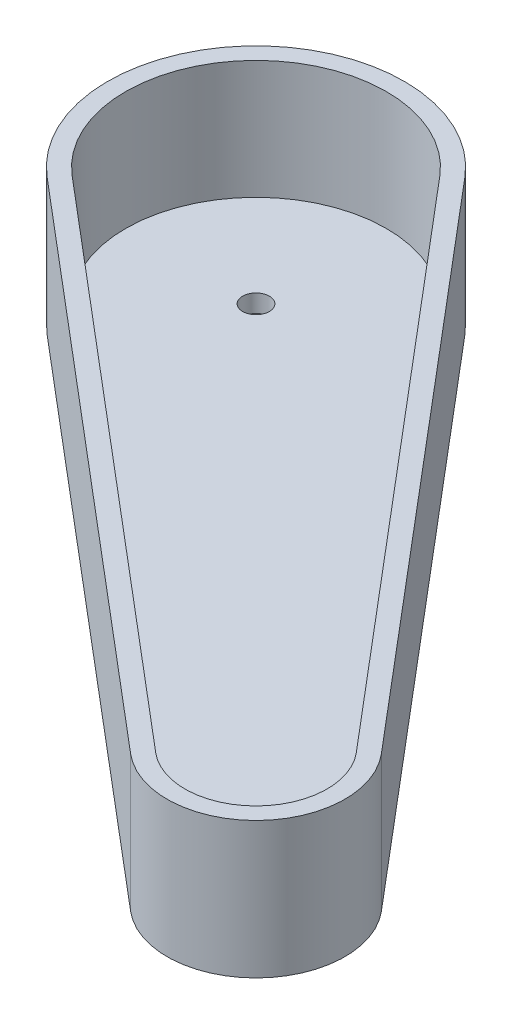
ISO-10303-21;
HEADER;
FILE_DESCRIPTION(('STEP AP214'),'2;1');
FILE_NAME('part.step','',(''),(''),'','','');
FILE_SCHEMA(('AUTOMOTIVE_DESIGN { 1 0 10303 214 1 1 1 1 }'));
ENDSEC;
DATA;
#1=APPLICATION_CONTEXT('core data for automotive mechanical design processes');
#2=APPLICATION_PROTOCOL_DEFINITION('international standard','automotive_design',2000,#1);
#3=PRODUCT_CONTEXT('',#1,'mechanical');
#4=PRODUCT('Part','Part','',(#3));
#5=PRODUCT_RELATED_PRODUCT_CATEGORY('part','',(#4));
#6=PRODUCT_DEFINITION_FORMATION('','',#4);
#7=PRODUCT_DEFINITION_CONTEXT('part definition',#1,'design');
#8=PRODUCT_DEFINITION('design','',#6,#7);
#9=PRODUCT_DEFINITION_SHAPE('','',#8);
#10=(LENGTH_UNIT() NAMED_UNIT(*) SI_UNIT(.MILLI.,.METRE.));
#11=(NAMED_UNIT(*) PLANE_ANGLE_UNIT() SI_UNIT($,.RADIAN.));
#12=(NAMED_UNIT(*) SI_UNIT($,.STERADIAN.) SOLID_ANGLE_UNIT());
#13=UNCERTAINTY_MEASURE_WITH_UNIT(LENGTH_MEASURE(1.E-05),#10,'distance_accuracy_value','');
#14=(GEOMETRIC_REPRESENTATION_CONTEXT(3) GLOBAL_UNCERTAINTY_ASSIGNED_CONTEXT((#13)) GLOBAL_UNIT_ASSIGNED_CONTEXT((#10,
#11,#12)) REPRESENTATION_CONTEXT('',''));
#15=CARTESIAN_POINT('',(0.,0.,0.));
#16=DIRECTION('',(0.,0.,1.));
#17=DIRECTION('',(1.,0.,0.));
#18=AXIS2_PLACEMENT_3D('',#15,#16,#17);
#19=CARTESIAN_POINT('',(-12.9144341357622,3.,15.2714567397174));
#20=DIRECTION('',(0.645721706788111,0.,-0.763572836985869));
#21=DIRECTION('',(-0.763572836985869,0.,-0.645721706788111));
#22=AXIS2_PLACEMENT_3D('',#19,#20,#21);
#23=PLANE('',#22);
#24=DIRECTION('',(0.763572836985869,0.,0.645721706788111));
#25=VECTOR('',#24,1.);
#26=CARTESIAN_POINT('',(-12.9144341357622,0.,15.2714567397174));
#27=LINE('',#26,#25);
#28=CARTESIAN_POINT('',(-58.5694495408956,0.,-23.3370859465461));
#29=VERTEX_POINT('',#28);
#30=CARTESIAN_POINT('',(32.7405812693714,0.,53.8799994259806));
#31=VERTEX_POINT('',#30);
#32=EDGE_CURVE('E133',#29,#31,#27,.T.);
#33=ORIENTED_EDGE('',*,*,#32,.T.);
#34=DIRECTION('',(0.,-1.,0.));
#35=VECTOR('',#34,1.);
#36=CARTESIAN_POINT('',(32.7405812693714,3.,53.8799994259806));
#37=LINE('',#36,#35);
#38=CARTESIAN_POINT('',(32.7405812693718,23.,53.8799994259802));
#39=VERTEX_POINT('',#38);
#40=EDGE_CURVE('E11',#39,#31,#37,.T.);
#41=ORIENTED_EDGE('',*,*,#40,.F.);
#42=DIRECTION('',(0.763572836985869,0.,0.645721706788111));
#43=VECTOR('',#42,1.);
#44=CARTESIAN_POINT('',(-12.9144341357622,23.,15.2714567397174));
#45=LINE('',#44,#43);
#46=CARTESIAN_POINT('',(-58.5694495408956,23.,-23.3370859465461));
#47=VERTEX_POINT('',#46);
#48=EDGE_CURVE('E146',#47,#39,#45,.T.);
#49=ORIENTED_EDGE('',*,*,#48,.F.);
#50=DIRECTION('',(0.,-1.,0.));
#51=VECTOR('',#50,1.);
#52=CARTESIAN_POINT('',(-58.5694495408956,3.,-23.3370859465461));
#53=LINE('',#52,#51);
#54=EDGE_CURVE('E194',#47,#29,#53,.T.);
#55=ORIENTED_EDGE('',*,*,#54,.T.);
#56=EDGE_LOOP('',(#33,#41,#49,#55));
#57=FACE_BOUND('',#56,.T.);
#58=ADVANCED_FACE('F47',(#57),#23,.F.);
#59=CARTESIAN_POINT('',(42.4264068711934,3.,42.4264068711923));
#60=DIRECTION('',(0.,-1.,0.));
#61=DIRECTION('',(0.,0.,-1.));
#62=AXIS2_PLACEMENT_3D('',#59,#60,#61);
#63=CYLINDRICAL_SURFACE('',#62,15.);
#64=CARTESIAN_POINT('',(42.4264068711934,0.,42.4264068711923));
#65=DIRECTION('',(0.,1.,0.));
#66=DIRECTION('',(0.,0.,1.));
#67=AXIS2_PLACEMENT_3D('',#64,#65,#66);
#68=CIRCLE('',#67,15.);
#69=CARTESIAN_POINT('',(53.8799994259812,0.,32.740581269371));
#70=VERTEX_POINT('',#69);
#71=EDGE_CURVE('E183',#31,#70,#68,.T.);
#72=ORIENTED_EDGE('',*,*,#71,.T.);
#73=DIRECTION('',(0.,-1.,0.));
#74=VECTOR('',#73,1.);
#75=CARTESIAN_POINT('',(53.8799994259812,3.,32.740581269371));
#76=LINE('',#75,#74);
#77=CARTESIAN_POINT('',(53.8799994259811,23.,32.7405812693711));
#78=VERTEX_POINT('',#77);
#79=EDGE_CURVE('E55',#78,#70,#76,.T.);
#80=ORIENTED_EDGE('',*,*,#79,.F.);
#81=CARTESIAN_POINT('',(42.4264068711934,23.,42.4264068711923));
#82=DIRECTION('',(0.,1.,0.));
#83=DIRECTION('',(0.,0.,1.));
#84=AXIS2_PLACEMENT_3D('',#81,#82,#83);
#85=CIRCLE('',#84,14.9999999999996);
#86=EDGE_CURVE('E150',#39,#78,#85,.T.);
#87=ORIENTED_EDGE('',*,*,#86,.F.);
#88=ORIENTED_EDGE('',*,*,#40,.T.);
#89=EDGE_LOOP('',(#72,#80,#87,#88));
#90=FACE_BOUND('',#89,.T.);
#91=ADVANCED_FACE('F207',(#90),#63,.T.);
#92=CARTESIAN_POINT('',(15.2714567397174,3.,-12.9144341357622));
#93=DIRECTION('',(0.763572836985869,0.,-0.645721706788111));
#94=DIRECTION('',(-0.645721706788111,0.,-0.763572836985869));
#95=AXIS2_PLACEMENT_3D('',#92,#93,#94);
#96=PLANE('',#95);
#97=DIRECTION('',(0.645721706788111,0.,0.763572836985869));
#98=VECTOR('',#97,1.);
#99=CARTESIAN_POINT('',(15.2714567397174,0.,-12.9144341357622));
#100=LINE('',#99,#98);
#101=CARTESIAN_POINT('',(-23.3370859465461,0.,-58.5694495408956));
#102=VERTEX_POINT('',#101);
#103=EDGE_CURVE('E187',#102,#70,#100,.T.);
#104=ORIENTED_EDGE('',*,*,#103,.F.);
#105=DIRECTION('',(0.,-1.,0.));
#106=VECTOR('',#105,1.);
#107=CARTESIAN_POINT('',(-23.3370859465461,3.,-58.5694495408956));
#108=LINE('',#107,#106);
#109=CARTESIAN_POINT('',(-23.3370859465461,23.,-58.5694495408956));
#110=VERTEX_POINT('',#109);
#111=EDGE_CURVE('E198',#110,#102,#108,.T.);
#112=ORIENTED_EDGE('',*,*,#111,.F.);
#113=DIRECTION('',(-0.645721706788111,0.,-0.763572836985869));
#114=VECTOR('',#113,1.);
#115=CARTESIAN_POINT('',(15.2714567397174,23.,-12.9144341357622));
#116=LINE('',#115,#114);
#117=EDGE_CURVE('E154',#78,#110,#116,.T.);
#118=ORIENTED_EDGE('',*,*,#117,.F.);
#119=ORIENTED_EDGE('',*,*,#79,.T.);
#120=EDGE_LOOP('',(#104,#112,#118,#119));
#121=FACE_BOUND('',#120,.T.);
#122=ADVANCED_FACE('F204',(#121),#96,.T.);
#123=CARTESIAN_POINT('',(-42.4264068711929,3.,-42.4264068711928));
#124=DIRECTION('',(0.,-1.,0.));
#125=DIRECTION('',(0.,0.,-1.));
#126=AXIS2_PLACEMENT_3D('',#123,#124,#125);
#127=CYLINDRICAL_SURFACE('',#126,25.);
#128=CARTESIAN_POINT('',(-42.4264068711929,0.,-42.4264068711928));
#129=DIRECTION('',(0.,1.,0.));
#130=DIRECTION('',(0.,0.,1.));
#131=AXIS2_PLACEMENT_3D('',#128,#129,#130);
#132=CIRCLE('',#131,25.);
#133=EDGE_CURVE('E191',#102,#29,#132,.T.);
#134=ORIENTED_EDGE('',*,*,#133,.T.);
#135=ORIENTED_EDGE('',*,*,#54,.F.);
#136=CARTESIAN_POINT('',(-42.4264068711929,23.,-42.4264068711928));
#137=DIRECTION('',(0.,1.,0.));
#138=DIRECTION('',(0.,0.,1.));
#139=AXIS2_PLACEMENT_3D('',#136,#137,#138);
#140=CIRCLE('',#139,25.);
#141=EDGE_CURVE('E158',#110,#47,#140,.T.);
#142=ORIENTED_EDGE('',*,*,#141,.F.);
#143=ORIENTED_EDGE('',*,*,#111,.T.);
#144=EDGE_LOOP('',(#134,#135,#142,#143));
#145=FACE_BOUND('',#144,.T.);
#146=ADVANCED_FACE('F213',(#145),#127,.T.);
#147=CARTESIAN_POINT('',(0.,0.,0.));
#148=DIRECTION('',(0.,1.,0.));
#149=DIRECTION('',(0.,0.,1.));
#150=AXIS2_PLACEMENT_3D('',#147,#148,#149);
#151=PLANE('',#150);
#152=CARTESIAN_POINT('',(-42.4264068711929,0.,-42.4264068711928));
#153=DIRECTION('',(0.,1.,0.));
#154=DIRECTION('',(0.,0.,1.));
#155=AXIS2_PLACEMENT_3D('',#152,#153,#154);
#156=CIRCLE('',#155,2.25);
#157=CARTESIAN_POINT('',(-42.4264068711929,0.,-40.1764068711928));
#158=VERTEX_POINT('',#157);
#159=EDGE_CURVE('E165',#158,#158,#156,.T.);
#160=ORIENTED_EDGE('',*,*,#159,.T.);
#161=EDGE_LOOP('',(#160));
#162=FACE_BOUND('',#161,.T.);
#163=CARTESIAN_POINT('',(42.4264068711934,0.,42.4264068711923));
#164=DIRECTION('',(0.,1.,0.));
#165=DIRECTION('',(0.,0.,1.));
#166=AXIS2_PLACEMENT_3D('',#163,#164,#165);
#167=CIRCLE('',#166,2.5);
#168=CARTESIAN_POINT('',(42.4264068711934,0.,44.9264068711923));
#169=VERTEX_POINT('',#168);
#170=EDGE_CURVE('E310',#169,#169,#167,.T.);
#171=ORIENTED_EDGE('',*,*,#170,.T.);
#172=EDGE_LOOP('',(#171));
#173=FACE_BOUND('',#172,.T.);
#174=ORIENTED_EDGE('',*,*,#32,.F.);
#175=ORIENTED_EDGE('',*,*,#133,.F.);
#176=ORIENTED_EDGE('',*,*,#103,.T.);
#177=ORIENTED_EDGE('',*,*,#71,.F.);
#178=EDGE_LOOP('',(#174,#175,#176,#177));
#179=FACE_BOUND('',#178,.T.);
#180=ADVANCED_FACE('F211',(#162,#173,#179),#151,.F.);
#181=CARTESIAN_POINT('',(12.9807382287599,23.,-10.977269015398));
#182=DIRECTION('',(0.763572836985867,0.,-0.645721706788114));
#183=DIRECTION('',(-0.645721706788114,0.,-0.763572836985867));
#184=AXIS2_PLACEMENT_3D('',#181,#182,#183);
#185=PLANE('',#184);
#186=DIRECTION('',(0.645721706788114,0.,0.763572836985867));
#187=VECTOR('',#186,1.);
#188=CARTESIAN_POINT('',(12.9807382287599,3.,-10.977269015398));
#189=LINE('',#188,#187);
#190=CARTESIAN_POINT('',(-25.6278044575038,3.,-56.6322844205313));
#191=VERTEX_POINT('',#190);
#192=CARTESIAN_POINT('',(51.5892809150235,3.,34.6777463897352));
#193=VERTEX_POINT('',#192);
#194=EDGE_CURVE('E130',#191,#193,#189,.T.);
#195=ORIENTED_EDGE('',*,*,#194,.T.);
#196=DIRECTION('',(0.,-1.,0.));
#197=VECTOR('',#196,1.);
#198=CARTESIAN_POINT('',(51.5892809150235,23.,34.6777463897352));
#199=LINE('',#198,#197);
#200=CARTESIAN_POINT('',(51.5892809150235,23.,34.6777463897352));
#201=VERTEX_POINT('',#200);
#202=EDGE_CURVE('E128',#201,#193,#199,.T.);
#203=ORIENTED_EDGE('',*,*,#202,.F.);
#204=DIRECTION('',(0.645721706788114,0.,0.763572836985867));
#205=VECTOR('',#204,1.);
#206=CARTESIAN_POINT('',(12.9807382287599,23.,-10.977269015398));
#207=LINE('',#206,#205);
#208=CARTESIAN_POINT('',(-25.6278044575038,23.,-56.6322844205313));
#209=VERTEX_POINT('',#208);
#210=EDGE_CURVE('E112',#209,#201,#207,.T.);
#211=ORIENTED_EDGE('',*,*,#210,.F.);
#212=DIRECTION('',(0.,-1.,0.));
#213=VECTOR('',#212,1.);
#214=CARTESIAN_POINT('',(-25.6278044575038,23.,-56.6322844205313));
#215=LINE('',#214,#213);
#216=EDGE_CURVE('E162',#209,#191,#215,.T.);
#217=ORIENTED_EDGE('',*,*,#216,.T.);
#218=EDGE_LOOP('',(#195,#203,#211,#217));
#219=FACE_BOUND('',#218,.T.);
#220=ADVANCED_FACE('F129',(#219),#185,.F.);
#221=CARTESIAN_POINT('',(42.4264068711934,23.,42.4264068711923));
#222=DIRECTION('',(0.,-1.,0.));
#223=DIRECTION('',(0.,0.,-1.));
#224=AXIS2_PLACEMENT_3D('',#221,#222,#223);
#225=CYLINDRICAL_SURFACE('',#224,11.9999999999996);
#226=CARTESIAN_POINT('',(42.4264068711934,3.,42.4264068711923));
#227=DIRECTION('',(0.,1.,0.));
#228=DIRECTION('',(0.,0.,1.));
#229=AXIS2_PLACEMENT_3D('',#226,#227,#228);
#230=CIRCLE('',#229,11.9999999999996);
#231=CARTESIAN_POINT('',(34.6777463897364,3.,51.5892809150226));
#232=VERTEX_POINT('',#231);
#233=EDGE_CURVE('E62',#232,#193,#230,.T.);
#234=ORIENTED_EDGE('',*,*,#233,.F.);
#235=DIRECTION('',(0.,-1.,0.));
#236=VECTOR('',#235,1.);
#237=CARTESIAN_POINT('',(34.6777463897364,23.,51.5892809150226));
#238=LINE('',#237,#236);
#239=CARTESIAN_POINT('',(34.6777463897364,23.,51.5892809150226));
#240=VERTEX_POINT('',#239);
#241=EDGE_CURVE('E134',#240,#232,#238,.T.);
#242=ORIENTED_EDGE('',*,*,#241,.F.);
#243=CARTESIAN_POINT('',(42.4264068711934,23.,42.4264068711923));
#244=DIRECTION('',(0.,1.,0.));
#245=DIRECTION('',(0.,0.,1.));
#246=AXIS2_PLACEMENT_3D('',#243,#244,#245);
#247=CIRCLE('',#246,11.9999999999996);
#248=EDGE_CURVE('E118',#240,#201,#247,.T.);
#249=ORIENTED_EDGE('',*,*,#248,.T.);
#250=ORIENTED_EDGE('',*,*,#202,.T.);
#251=EDGE_LOOP('',(#234,#242,#249,#250));
#252=FACE_BOUND('',#251,.T.);
#253=ADVANCED_FACE('F136',(#252),#225,.F.);
#254=CARTESIAN_POINT('',(-10.9772690153974,23.,12.9807382287595));
#255=DIRECTION('',(0.645721706788104,0.,-0.763572836985875));
#256=DIRECTION('',(-0.763572836985875,0.,-0.645721706788104));
#257=AXIS2_PLACEMENT_3D('',#254,#255,#256);
#258=PLANE('',#257);
#259=DIRECTION('',(0.763572836985875,0.,0.645721706788104));
#260=VECTOR('',#259,1.);
#261=CARTESIAN_POINT('',(-10.9772690153974,3.,12.9807382287595));
#262=LINE('',#261,#260);
#263=CARTESIAN_POINT('',(-56.6322844205312,3.,-25.6278044575036));
#264=VERTEX_POINT('',#263);
#265=EDGE_CURVE('E67',#264,#232,#262,.T.);
#266=ORIENTED_EDGE('',*,*,#265,.F.);
#267=DIRECTION('',(0.,-1.,0.));
#268=VECTOR('',#267,1.);
#269=CARTESIAN_POINT('',(-56.6322844205312,23.,-25.6278044575035));
#270=LINE('',#269,#268);
#271=CARTESIAN_POINT('',(-56.6322844205312,23.,-25.6278044575035));
#272=VERTEX_POINT('',#271);
#273=EDGE_CURVE('E174',#272,#264,#270,.T.);
#274=ORIENTED_EDGE('',*,*,#273,.F.);
#275=DIRECTION('',(0.763572836985875,0.,0.645721706788104));
#276=VECTOR('',#275,1.);
#277=CARTESIAN_POINT('',(-10.9772690153974,23.,12.9807382287595));
#278=LINE('',#277,#276);
#279=EDGE_CURVE('E138',#272,#240,#278,.T.);
#280=ORIENTED_EDGE('',*,*,#279,.T.);
#281=ORIENTED_EDGE('',*,*,#241,.T.);
#282=EDGE_LOOP('',(#266,#274,#280,#281));
#283=FACE_BOUND('',#282,.T.);
#284=ADVANCED_FACE('F229',(#283),#258,.T.);
#285=CARTESIAN_POINT('',(-42.4264068711929,23.,-42.4264068711928));
#286=DIRECTION('',(0.,-1.,0.));
#287=DIRECTION('',(0.,0.,-1.));
#288=AXIS2_PLACEMENT_3D('',#285,#286,#287);
#289=CYLINDRICAL_SURFACE('',#288,22.);
#290=CARTESIAN_POINT('',(-42.4264068711929,3.,-42.4264068711928));
#291=DIRECTION('',(0.,1.,0.));
#292=DIRECTION('',(0.,0.,1.));
#293=AXIS2_PLACEMENT_3D('',#290,#291,#292);
#294=CIRCLE('',#293,22.);
#295=EDGE_CURVE('E125',#191,#264,#294,.T.);
#296=ORIENTED_EDGE('',*,*,#295,.F.);
#297=ORIENTED_EDGE('',*,*,#216,.F.);
#298=CARTESIAN_POINT('',(-42.4264068711929,23.,-42.4264068711928));
#299=DIRECTION('',(0.,1.,0.));
#300=DIRECTION('',(0.,0.,1.));
#301=AXIS2_PLACEMENT_3D('',#298,#299,#300);
#302=CIRCLE('',#301,22.);
#303=EDGE_CURVE('E121',#209,#272,#302,.T.);
#304=ORIENTED_EDGE('',*,*,#303,.T.);
#305=ORIENTED_EDGE('',*,*,#273,.T.);
#306=EDGE_LOOP('',(#296,#297,#304,#305));
#307=FACE_BOUND('',#306,.T.);
#308=ADVANCED_FACE('F219',(#307),#289,.F.);
#309=CARTESIAN_POINT('',(0.,23.,0.));
#310=DIRECTION('',(0.,1.,0.));
#311=DIRECTION('',(0.,0.,1.));
#312=AXIS2_PLACEMENT_3D('',#309,#310,#311);
#313=PLANE('',#312);
#314=ORIENTED_EDGE('',*,*,#210,.T.);
#315=ORIENTED_EDGE('',*,*,#248,.F.);
#316=ORIENTED_EDGE('',*,*,#279,.F.);
#317=ORIENTED_EDGE('',*,*,#303,.F.);
#318=EDGE_LOOP('',(#314,#315,#316,#317));
#319=FACE_BOUND('',#318,.T.);
#320=ORIENTED_EDGE('',*,*,#48,.T.);
#321=ORIENTED_EDGE('',*,*,#86,.T.);
#322=ORIENTED_EDGE('',*,*,#117,.T.);
#323=ORIENTED_EDGE('',*,*,#141,.T.);
#324=EDGE_LOOP('',(#320,#321,#322,#323));
#325=FACE_BOUND('',#324,.T.);
#326=ADVANCED_FACE('F114',(#319,#325),#313,.T.);
#327=CARTESIAN_POINT('',(0.,3.,0.));
#328=DIRECTION('',(0.,1.,0.));
#329=DIRECTION('',(0.,0.,1.));
#330=AXIS2_PLACEMENT_3D('',#327,#328,#329);
#331=PLANE('',#330);
#332=CARTESIAN_POINT('',(-42.4264068711929,3.,-42.4264068711928));
#333=DIRECTION('',(0.,1.,0.));
#334=DIRECTION('',(0.,0.,1.));
#335=AXIS2_PLACEMENT_3D('',#332,#333,#334);
#336=CIRCLE('',#335,2.25);
#337=CARTESIAN_POINT('',(-42.4264068711929,3.,-40.1764068711928));
#338=VERTEX_POINT('',#337);
#339=EDGE_CURVE('E302',#338,#338,#336,.T.);
#340=ORIENTED_EDGE('',*,*,#339,.F.);
#341=EDGE_LOOP('',(#340));
#342=FACE_BOUND('',#341,.T.);
#343=CARTESIAN_POINT('',(42.4264068711934,3.,42.4264068711923));
#344=DIRECTION('',(0.,1.,0.));
#345=DIRECTION('',(0.,0.,1.));
#346=AXIS2_PLACEMENT_3D('',#343,#344,#345);
#347=CIRCLE('',#346,2.5);
#348=CARTESIAN_POINT('',(42.4264068711934,3.,44.9264068711923));
#349=VERTEX_POINT('',#348);
#350=EDGE_CURVE('E304',#349,#349,#347,.T.);
#351=ORIENTED_EDGE('',*,*,#350,.F.);
#352=EDGE_LOOP('',(#351));
#353=FACE_BOUND('',#352,.T.);
#354=ORIENTED_EDGE('',*,*,#233,.T.);
#355=ORIENTED_EDGE('',*,*,#194,.F.);
#356=ORIENTED_EDGE('',*,*,#295,.T.);
#357=ORIENTED_EDGE('',*,*,#265,.T.);
#358=EDGE_LOOP('',(#354,#355,#356,#357));
#359=FACE_BOUND('',#358,.T.);
#360=ADVANCED_FACE('F218',(#342,#353,#359),#331,.T.);
#361=CARTESIAN_POINT('',(42.4264068711934,0.,42.4264068711923));
#362=DIRECTION('',(0.,1.,0.));
#363=DIRECTION('',(0.,0.,1.));
#364=AXIS2_PLACEMENT_3D('',#361,#362,#363);
#365=CYLINDRICAL_SURFACE('',#364,2.5);
#366=ORIENTED_EDGE('',*,*,#170,.F.);
#367=EDGE_LOOP('',(#366));
#368=FACE_BOUND('',#367,.T.);
#369=ORIENTED_EDGE('',*,*,#350,.T.);
#370=EDGE_LOOP('',(#369));
#371=FACE_BOUND('',#370,.T.);
#372=ADVANCED_FACE('F226',(#368,#371),#365,.F.);
#373=CARTESIAN_POINT('',(-42.4264068711929,0.,-42.4264068711928));
#374=DIRECTION('',(0.,1.,0.));
#375=DIRECTION('',(0.,0.,1.));
#376=AXIS2_PLACEMENT_3D('',#373,#374,#375);
#377=CYLINDRICAL_SURFACE('',#376,2.25);
#378=ORIENTED_EDGE('',*,*,#159,.F.);
#379=EDGE_LOOP('',(#378));
#380=FACE_BOUND('',#379,.T.);
#381=ORIENTED_EDGE('',*,*,#339,.T.);
#382=EDGE_LOOP('',(#381));
#383=FACE_BOUND('',#382,.T.);
#384=ADVANCED_FACE('F285',(#380,#383),#377,.F.);
#385=CLOSED_SHELL('',(#58,#91,#122,#146,#180,#220,#253,#284,#308,#326,#360,#372,#384));
#386=MANIFOLD_SOLID_BREP('B2',#385);
#387=ADVANCED_BREP_SHAPE_REPRESENTATION('',(#18,#386),#14);
#388=SHAPE_DEFINITION_REPRESENTATION(#9,#387);
ENDSEC;
END-ISO-10303-21;
